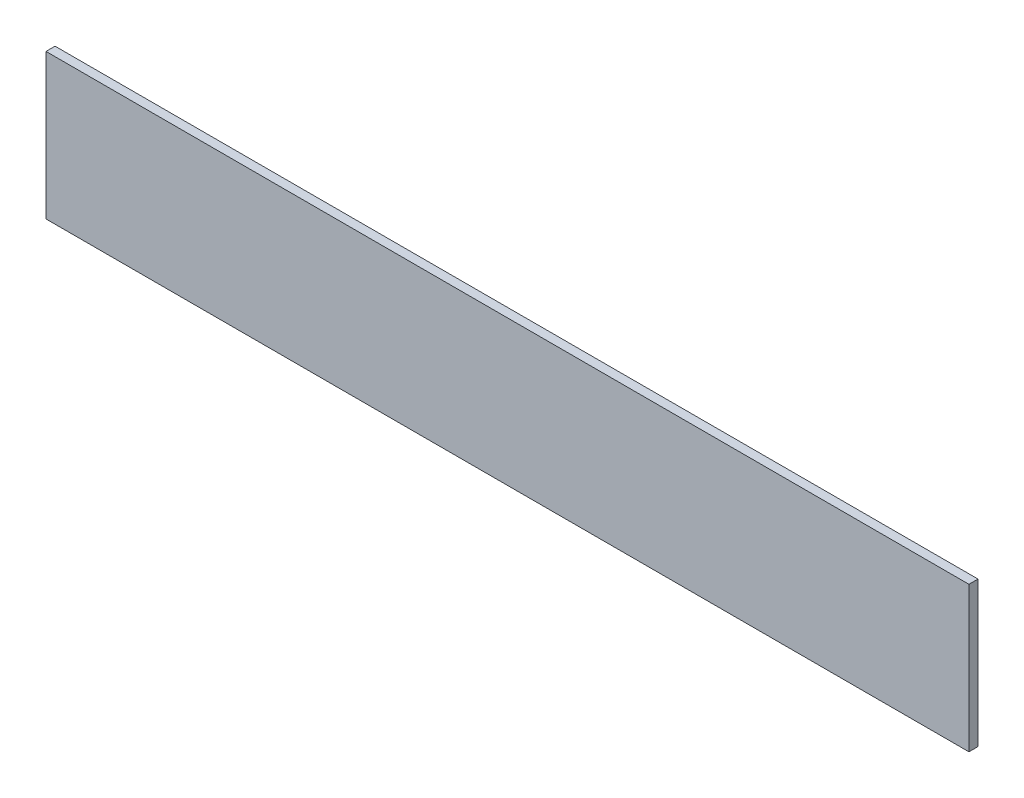
ISO-10303-21;
HEADER;
FILE_DESCRIPTION(('STEP AP214'),'2;1');
FILE_NAME('part.step','',(''),(''),'','','');
FILE_SCHEMA(('AUTOMOTIVE_DESIGN { 1 0 10303 214 1 1 1 1 }'));
ENDSEC;
DATA;
#1=APPLICATION_CONTEXT('core data for automotive mechanical design processes');
#2=APPLICATION_PROTOCOL_DEFINITION('international standard','automotive_design',2000,#1);
#3=PRODUCT_CONTEXT('',#1,'mechanical');
#4=PRODUCT('Part','Part','',(#3));
#5=PRODUCT_RELATED_PRODUCT_CATEGORY('part','',(#4));
#6=PRODUCT_DEFINITION_FORMATION('','',#4);
#7=PRODUCT_DEFINITION_CONTEXT('part definition',#1,'design');
#8=PRODUCT_DEFINITION('design','',#6,#7);
#9=PRODUCT_DEFINITION_SHAPE('','',#8);
#10=(LENGTH_UNIT() NAMED_UNIT(*) SI_UNIT(.MILLI.,.METRE.));
#11=(NAMED_UNIT(*) PLANE_ANGLE_UNIT() SI_UNIT($,.RADIAN.));
#12=(NAMED_UNIT(*) SI_UNIT($,.STERADIAN.) SOLID_ANGLE_UNIT());
#13=UNCERTAINTY_MEASURE_WITH_UNIT(LENGTH_MEASURE(1.E-05),#10,'distance_accuracy_value','');
#14=(GEOMETRIC_REPRESENTATION_CONTEXT(3) GLOBAL_UNCERTAINTY_ASSIGNED_CONTEXT((#13)) GLOBAL_UNIT_ASSIGNED_CONTEXT((#10,
#11,#12)) REPRESENTATION_CONTEXT('',''));
#15=CARTESIAN_POINT('',(0.,0.,0.));
#16=DIRECTION('',(0.,0.,1.));
#17=DIRECTION('',(1.,0.,0.));
#18=AXIS2_PLACEMENT_3D('',#15,#16,#17);
#19=CARTESIAN_POINT('',(0.,0.,6.35));
#20=DIRECTION('',(1.,0.,0.));
#21=DIRECTION('',(0.,0.,-1.));
#22=AXIS2_PLACEMENT_3D('',#19,#20,#21);
#23=PLANE('',#22);
#24=DIRECTION('',(0.,-1.,0.));
#25=VECTOR('',#24,1.);
#26=CARTESIAN_POINT('',(0.,0.,0.));
#27=LINE('',#26,#25);
#28=CARTESIAN_POINT('',(0.,101.6,0.));
#29=VERTEX_POINT('',#28);
#30=CARTESIAN_POINT('',(0.,0.,0.));
#31=VERTEX_POINT('',#30);
#32=EDGE_CURVE('E95',#29,#31,#27,.T.);
#33=ORIENTED_EDGE('',*,*,#32,.T.);
#34=DIRECTION('',(0.,0.,-1.));
#35=VECTOR('',#34,1.);
#36=CARTESIAN_POINT('',(0.,0.,6.35));
#37=LINE('',#36,#35);
#38=CARTESIAN_POINT('',(0.,0.,6.35));
#39=VERTEX_POINT('',#38);
#40=EDGE_CURVE('E11',#39,#31,#37,.T.);
#41=ORIENTED_EDGE('',*,*,#40,.F.);
#42=DIRECTION('',(0.,-1.,0.));
#43=VECTOR('',#42,1.);
#44=CARTESIAN_POINT('',(0.,0.,6.35));
#45=LINE('',#44,#43);
#46=CARTESIAN_POINT('',(0.,101.6,6.35));
#47=VERTEX_POINT('',#46);
#48=EDGE_CURVE('E83',#47,#39,#45,.T.);
#49=ORIENTED_EDGE('',*,*,#48,.F.);
#50=DIRECTION('',(0.,0.,-1.));
#51=VECTOR('',#50,1.);
#52=CARTESIAN_POINT('',(0.,101.6,6.35));
#53=LINE('',#52,#51);
#54=EDGE_CURVE('E91',#47,#29,#53,.T.);
#55=ORIENTED_EDGE('',*,*,#54,.T.);
#56=EDGE_LOOP('',(#33,#41,#49,#55));
#57=FACE_BOUND('',#56,.T.);
#58=ADVANCED_FACE('F32',(#57),#23,.F.);
#59=CARTESIAN_POINT('',(0.,0.,6.35));
#60=DIRECTION('',(0.,1.,0.));
#61=DIRECTION('',(0.,0.,1.));
#62=AXIS2_PLACEMENT_3D('',#59,#60,#61);
#63=PLANE('',#62);
#64=DIRECTION('',(1.,0.,0.));
#65=VECTOR('',#64,1.);
#66=CARTESIAN_POINT('',(0.,0.,0.));
#67=LINE('',#66,#65);
#68=CARTESIAN_POINT('',(646.21625164388,0.,0.));
#69=VERTEX_POINT('',#68);
#70=EDGE_CURVE('E87',#31,#69,#67,.T.);
#71=ORIENTED_EDGE('',*,*,#70,.T.);
#72=DIRECTION('',(0.,0.,-1.));
#73=VECTOR('',#72,1.);
#74=CARTESIAN_POINT('',(646.21625164388,0.,6.35));
#75=LINE('',#74,#73);
#76=CARTESIAN_POINT('',(646.21625164388,0.,6.35));
#77=VERTEX_POINT('',#76);
#78=EDGE_CURVE('E40',#77,#69,#75,.T.);
#79=ORIENTED_EDGE('',*,*,#78,.F.);
#80=DIRECTION('',(1.,0.,0.));
#81=VECTOR('',#80,1.);
#82=CARTESIAN_POINT('',(0.,0.,6.35));
#83=LINE('',#82,#81);
#84=EDGE_CURVE('E78',#39,#77,#83,.T.);
#85=ORIENTED_EDGE('',*,*,#84,.F.);
#86=ORIENTED_EDGE('',*,*,#40,.T.);
#87=EDGE_LOOP('',(#71,#79,#85,#86));
#88=FACE_BOUND('',#87,.T.);
#89=ADVANCED_FACE('F86',(#88),#63,.F.);
#90=CARTESIAN_POINT('',(646.21625164388,0.,6.35));
#91=DIRECTION('',(-1.,0.,0.));
#92=DIRECTION('',(0.,0.,1.));
#93=AXIS2_PLACEMENT_3D('',#90,#91,#92);
#94=PLANE('',#93);
#95=DIRECTION('',(0.,1.,0.));
#96=VECTOR('',#95,1.);
#97=CARTESIAN_POINT('',(646.21625164388,0.,0.));
#98=LINE('',#97,#96);
#99=CARTESIAN_POINT('',(646.21625164388,101.6,0.));
#100=VERTEX_POINT('',#99);
#101=EDGE_CURVE('E65',#69,#100,#98,.T.);
#102=ORIENTED_EDGE('',*,*,#101,.T.);
#103=DIRECTION('',(0.,0.,-1.));
#104=VECTOR('',#103,1.);
#105=CARTESIAN_POINT('',(646.21625164388,101.6,6.35));
#106=LINE('',#105,#104);
#107=CARTESIAN_POINT('',(646.21625164388,101.6,6.35));
#108=VERTEX_POINT('',#107);
#109=EDGE_CURVE('E88',#108,#100,#106,.T.);
#110=ORIENTED_EDGE('',*,*,#109,.F.);
#111=DIRECTION('',(0.,1.,0.));
#112=VECTOR('',#111,1.);
#113=CARTESIAN_POINT('',(646.21625164388,0.,6.35));
#114=LINE('',#113,#112);
#115=EDGE_CURVE('E81',#77,#108,#114,.T.);
#116=ORIENTED_EDGE('',*,*,#115,.F.);
#117=ORIENTED_EDGE('',*,*,#78,.T.);
#118=EDGE_LOOP('',(#102,#110,#116,#117));
#119=FACE_BOUND('',#118,.T.);
#120=ADVANCED_FACE('F89',(#119),#94,.F.);
#121=CARTESIAN_POINT('',(0.,101.6,6.35));
#122=DIRECTION('',(0.,-1.,0.));
#123=DIRECTION('',(0.,0.,-1.));
#124=AXIS2_PLACEMENT_3D('',#121,#122,#123);
#125=PLANE('',#124);
#126=DIRECTION('',(-1.,0.,0.));
#127=VECTOR('',#126,1.);
#128=CARTESIAN_POINT('',(0.,101.6,0.));
#129=LINE('',#128,#127);
#130=EDGE_CURVE('E71',#100,#29,#129,.T.);
#131=ORIENTED_EDGE('',*,*,#130,.T.);
#132=ORIENTED_EDGE('',*,*,#54,.F.);
#133=DIRECTION('',(-1.,0.,0.));
#134=VECTOR('',#133,1.);
#135=CARTESIAN_POINT('',(0.,101.6,6.35));
#136=LINE('',#135,#134);
#137=EDGE_CURVE('E48',#108,#47,#136,.T.);
#138=ORIENTED_EDGE('',*,*,#137,.F.);
#139=ORIENTED_EDGE('',*,*,#109,.T.);
#140=EDGE_LOOP('',(#131,#132,#138,#139));
#141=FACE_BOUND('',#140,.T.);
#142=ADVANCED_FACE('F102',(#141),#125,.F.);
#143=CARTESIAN_POINT('',(0.,0.,6.35));
#144=DIRECTION('',(0.,0.,-1.));
#145=DIRECTION('',(-1.,0.,0.));
#146=AXIS2_PLACEMENT_3D('',#143,#144,#145);
#147=PLANE('',#146);
#148=ORIENTED_EDGE('',*,*,#48,.T.);
#149=ORIENTED_EDGE('',*,*,#84,.T.);
#150=ORIENTED_EDGE('',*,*,#115,.T.);
#151=ORIENTED_EDGE('',*,*,#137,.T.);
#152=EDGE_LOOP('',(#148,#149,#150,#151));
#153=FACE_BOUND('',#152,.T.);
#154=ADVANCED_FACE('F79',(#153),#147,.F.);
#155=CARTESIAN_POINT('',(0.,0.,0.));
#156=DIRECTION('',(0.,0.,-1.));
#157=DIRECTION('',(-1.,0.,0.));
#158=AXIS2_PLACEMENT_3D('',#155,#156,#157);
#159=PLANE('',#158);
#160=ORIENTED_EDGE('',*,*,#32,.F.);
#161=ORIENTED_EDGE('',*,*,#130,.F.);
#162=ORIENTED_EDGE('',*,*,#101,.F.);
#163=ORIENTED_EDGE('',*,*,#70,.F.);
#164=EDGE_LOOP('',(#160,#161,#162,#163));
#165=FACE_BOUND('',#164,.T.);
#166=ADVANCED_FACE('F105',(#165),#159,.T.);
#167=CLOSED_SHELL('',(#58,#89,#120,#142,#154,#166));
#168=MANIFOLD_SOLID_BREP('B2',#167);
#169=ADVANCED_BREP_SHAPE_REPRESENTATION('',(#18,#168),#14);
#170=SHAPE_DEFINITION_REPRESENTATION(#9,#169);
ENDSEC;
END-ISO-10303-21;
